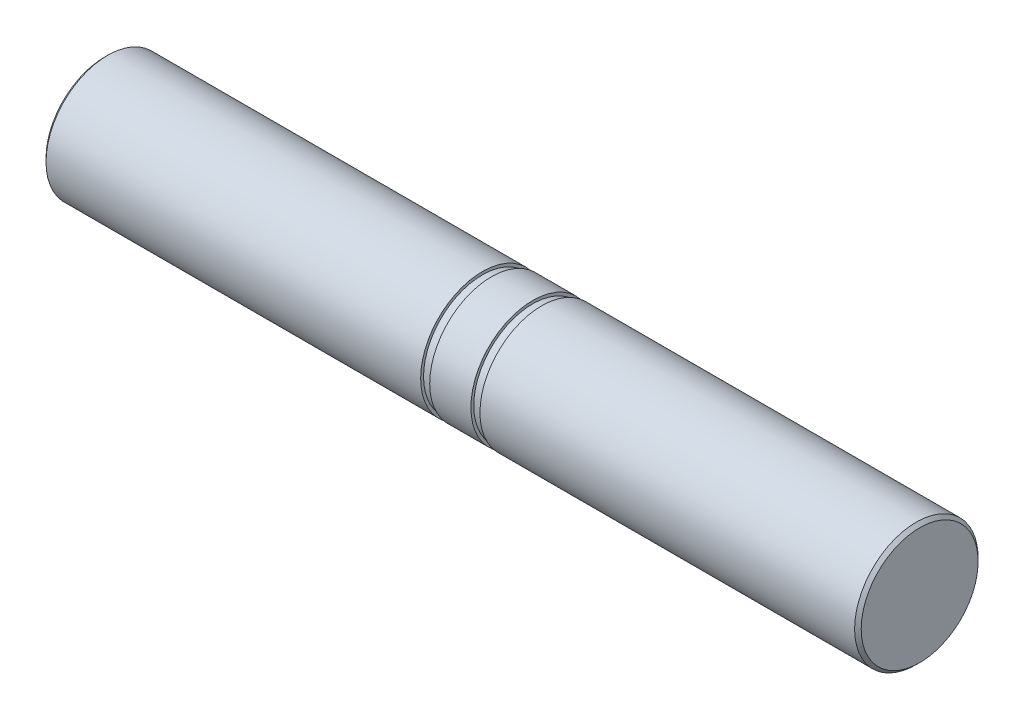
ISO-10303-21;
HEADER;
FILE_DESCRIPTION(('STEP AP214'),'2;1');
FILE_NAME('part.step','',(''),(''),'','','');
FILE_SCHEMA(('AUTOMOTIVE_DESIGN { 1 0 10303 214 1 1 1 1 }'));
ENDSEC;
DATA;
#1=APPLICATION_CONTEXT('core data for automotive mechanical design processes');
#2=APPLICATION_PROTOCOL_DEFINITION('international standard','automotive_design',2000,#1);
#3=PRODUCT_CONTEXT('',#1,'mechanical');
#4=PRODUCT('Part','Part','',(#3));
#5=PRODUCT_RELATED_PRODUCT_CATEGORY('part','',(#4));
#6=PRODUCT_DEFINITION_FORMATION('','',#4);
#7=PRODUCT_DEFINITION_CONTEXT('part definition',#1,'design');
#8=PRODUCT_DEFINITION('design','',#6,#7);
#9=PRODUCT_DEFINITION_SHAPE('','',#8);
#10=(LENGTH_UNIT() NAMED_UNIT(*) SI_UNIT(.MILLI.,.METRE.));
#11=(NAMED_UNIT(*) PLANE_ANGLE_UNIT() SI_UNIT($,.RADIAN.));
#12=(NAMED_UNIT(*) SI_UNIT($,.STERADIAN.) SOLID_ANGLE_UNIT());
#13=UNCERTAINTY_MEASURE_WITH_UNIT(LENGTH_MEASURE(1.E-05),#10,'distance_accuracy_value','');
#14=(GEOMETRIC_REPRESENTATION_CONTEXT(3) GLOBAL_UNCERTAINTY_ASSIGNED_CONTEXT((#13)) GLOBAL_UNIT_ASSIGNED_CONTEXT((#10,
#11,#12)) REPRESENTATION_CONTEXT('',''));
#15=CARTESIAN_POINT('',(0.,0.,0.));
#16=DIRECTION('',(0.,0.,1.));
#17=DIRECTION('',(1.,0.,0.));
#18=AXIS2_PLACEMENT_3D('',#15,#16,#17);
#19=CARTESIAN_POINT('',(49.5,0.,0.));
#20=DIRECTION('',(-1.,0.,0.));
#21=DIRECTION('',(0.,0.,-1.));
#22=AXIS2_PLACEMENT_3D('',#19,#20,#21);
#23=CYLINDRICAL_SURFACE('',#22,7.5);
#24=CARTESIAN_POINT('',(-3.6,0.,0.));
#25=DIRECTION('',(-1.,0.,0.));
#26=DIRECTION('',(0.,0.,1.));
#27=AXIS2_PLACEMENT_3D('',#24,#25,#26);
#28=CIRCLE('',#27,7.5);
#29=CARTESIAN_POINT('',(-3.6,0.,7.5));
#30=VERTEX_POINT('',#29);
#31=EDGE_CURVE('E56',#30,#30,#28,.T.);
#32=ORIENTED_EDGE('',*,*,#31,.T.);
#33=EDGE_LOOP('',(#32));
#34=FACE_BOUND('',#33,.T.);
#35=CARTESIAN_POINT('',(-49.1,0.,0.));
#36=DIRECTION('',(-1.,0.,0.));
#37=DIRECTION('',(0.,0.,1.));
#38=AXIS2_PLACEMENT_3D('',#35,#36,#37);
#39=CIRCLE('',#38,7.5);
#40=CARTESIAN_POINT('',(-49.1,0.,7.5));
#41=VERTEX_POINT('',#40);
#42=EDGE_CURVE('E43',#41,#41,#39,.T.);
#43=ORIENTED_EDGE('',*,*,#42,.F.);
#44=EDGE_LOOP('',(#43));
#45=FACE_BOUND('',#44,.T.);
#46=ADVANCED_FACE('F32',(#34,#45),#23,.T.);
#47=CARTESIAN_POINT('',(-49.5,0.,0.));
#48=DIRECTION('',(1.,0.,0.));
#49=DIRECTION('',(0.,0.,1.));
#50=AXIS2_PLACEMENT_3D('',#47,#48,#49);
#51=PLANE('',#50);
#52=CARTESIAN_POINT('',(-49.5,0.,0.));
#53=DIRECTION('',(-1.,0.,0.));
#54=DIRECTION('',(0.,0.,1.));
#55=AXIS2_PLACEMENT_3D('',#52,#53,#54);
#56=CIRCLE('',#55,7.09999999999999);
#57=CARTESIAN_POINT('',(-49.5,0.,7.09999999999999));
#58=VERTEX_POINT('',#57);
#59=EDGE_CURVE('E10',#58,#58,#56,.F.);
#60=ORIENTED_EDGE('',*,*,#59,.F.);
#61=EDGE_LOOP('',(#60));
#62=FACE_BOUND('',#61,.T.);
#63=ADVANCED_FACE('F91',(#62),#51,.F.);
#64=CARTESIAN_POINT('',(-49.1,0.,0.));
#65=DIRECTION('',(1.,0.,0.));
#66=DIRECTION('',(0.,0.,1.));
#67=AXIS2_PLACEMENT_3D('',#64,#65,#66);
#68=CONICAL_SURFACE('',#67,7.5,0.785398163397441);
#69=ORIENTED_EDGE('',*,*,#59,.T.);
#70=EDGE_LOOP('',(#69));
#71=FACE_BOUND('',#70,.T.);
#72=ORIENTED_EDGE('',*,*,#42,.T.);
#73=EDGE_LOOP('',(#72));
#74=FACE_BOUND('',#73,.T.);
#75=ADVANCED_FACE('F34',(#71,#74),#68,.T.);
#76=CARTESIAN_POINT('',(-3.6,7.5,0.));
#77=DIRECTION('',(-1.,0.,0.));
#78=DIRECTION('',(0.,0.,-1.));
#79=AXIS2_PLACEMENT_3D('',#76,#77,#78);
#80=PLANE('',#79);
#81=CARTESIAN_POINT('',(-3.6,0.,0.));
#82=DIRECTION('',(-1.,0.,0.));
#83=DIRECTION('',(0.,0.,1.));
#84=AXIS2_PLACEMENT_3D('',#81,#82,#83);
#85=CIRCLE('',#84,7.15);
#86=CARTESIAN_POINT('',(-3.6,0.,7.15));
#87=VERTEX_POINT('',#86);
#88=EDGE_CURVE('E52',#87,#87,#85,.T.);
#89=ORIENTED_EDGE('',*,*,#88,.T.);
#90=EDGE_LOOP('',(#89));
#91=FACE_BOUND('',#90,.T.);
#92=ORIENTED_EDGE('',*,*,#31,.F.);
#93=EDGE_LOOP('',(#92));
#94=FACE_BOUND('',#93,.T.);
#95=ADVANCED_FACE('F79',(#91,#94),#80,.F.);
#96=CARTESIAN_POINT('',(0.,0.,0.));
#97=DIRECTION('',(1.,0.,0.));
#98=DIRECTION('',(0.,0.,1.));
#99=AXIS2_PLACEMENT_3D('',#96,#97,#98);
#100=CYLINDRICAL_SURFACE('',#99,7.15);
#101=CARTESIAN_POINT('',(-2.5,0.,0.));
#102=DIRECTION('',(-1.,0.,0.));
#103=DIRECTION('',(0.,0.,1.));
#104=AXIS2_PLACEMENT_3D('',#101,#102,#103);
#105=CIRCLE('',#104,7.15);
#106=CARTESIAN_POINT('',(-2.5,0.,7.15));
#107=VERTEX_POINT('',#106);
#108=EDGE_CURVE('E68',#107,#107,#105,.T.);
#109=ORIENTED_EDGE('',*,*,#108,.T.);
#110=EDGE_LOOP('',(#109));
#111=FACE_BOUND('',#110,.T.);
#112=ORIENTED_EDGE('',*,*,#88,.F.);
#113=EDGE_LOOP('',(#112));
#114=FACE_BOUND('',#113,.T.);
#115=ADVANCED_FACE('F81',(#111,#114),#100,.T.);
#116=CARTESIAN_POINT('',(-2.5,7.5,0.));
#117=DIRECTION('',(1.,0.,0.));
#118=DIRECTION('',(0.,0.,1.));
#119=AXIS2_PLACEMENT_3D('',#116,#117,#118);
#120=PLANE('',#119);
#121=CARTESIAN_POINT('',(-2.5,0.,0.));
#122=DIRECTION('',(-1.,0.,0.));
#123=DIRECTION('',(0.,0.,1.));
#124=AXIS2_PLACEMENT_3D('',#121,#122,#123);
#125=CIRCLE('',#124,7.5);
#126=CARTESIAN_POINT('',(-2.5,0.,7.5));
#127=VERTEX_POINT('',#126);
#128=EDGE_CURVE('E71',#127,#127,#125,.T.);
#129=ORIENTED_EDGE('',*,*,#128,.T.);
#130=EDGE_LOOP('',(#129));
#131=FACE_BOUND('',#130,.T.);
#132=ORIENTED_EDGE('',*,*,#108,.F.);
#133=EDGE_LOOP('',(#132));
#134=FACE_BOUND('',#133,.T.);
#135=ADVANCED_FACE('F88',(#131,#134),#120,.F.);
#136=ORIENTED_EDGE('',*,*,#128,.F.);
#137=EDGE_LOOP('',(#136));
#138=FACE_BOUND('',#137,.T.);
#139=CARTESIAN_POINT('',(2.5,0.,0.));
#140=DIRECTION('',(-1.,0.,0.));
#141=DIRECTION('',(0.,0.,1.));
#142=AXIS2_PLACEMENT_3D('',#139,#140,#141);
#143=CIRCLE('',#142,7.5);
#144=CARTESIAN_POINT('',(2.5,0.,7.5));
#145=VERTEX_POINT('',#144);
#146=EDGE_CURVE('E63',#145,#145,#143,.T.);
#147=ORIENTED_EDGE('',*,*,#146,.T.);
#148=EDGE_LOOP('',(#147));
#149=FACE_BOUND('',#148,.T.);
#150=ADVANCED_FACE('F95',(#138,#149),#23,.T.);
#151=CARTESIAN_POINT('',(2.5,7.5,0.));
#152=DIRECTION('',(-1.,0.,0.));
#153=DIRECTION('',(0.,0.,-1.));
#154=AXIS2_PLACEMENT_3D('',#151,#152,#153);
#155=PLANE('',#154);
#156=CARTESIAN_POINT('',(2.5,0.,0.));
#157=DIRECTION('',(-1.,0.,0.));
#158=DIRECTION('',(0.,0.,1.));
#159=AXIS2_PLACEMENT_3D('',#156,#157,#158);
#160=CIRCLE('',#159,7.15);
#161=CARTESIAN_POINT('',(2.5,0.,7.15));
#162=VERTEX_POINT('',#161);
#163=EDGE_CURVE('E53',#162,#162,#160,.T.);
#164=ORIENTED_EDGE('',*,*,#163,.T.);
#165=EDGE_LOOP('',(#164));
#166=FACE_BOUND('',#165,.T.);
#167=ORIENTED_EDGE('',*,*,#146,.F.);
#168=EDGE_LOOP('',(#167));
#169=FACE_BOUND('',#168,.T.);
#170=ADVANCED_FACE('F103',(#166,#169),#155,.F.);
#171=CARTESIAN_POINT('',(0.,0.,0.));
#172=DIRECTION('',(1.,0.,0.));
#173=DIRECTION('',(0.,0.,1.));
#174=AXIS2_PLACEMENT_3D('',#171,#172,#173);
#175=CYLINDRICAL_SURFACE('',#174,7.15);
#176=CARTESIAN_POINT('',(3.6,0.,0.));
#177=DIRECTION('',(-1.,0.,0.));
#178=DIRECTION('',(0.,0.,1.));
#179=AXIS2_PLACEMENT_3D('',#176,#177,#178);
#180=CIRCLE('',#179,7.15);
#181=CARTESIAN_POINT('',(3.6,0.,7.15));
#182=VERTEX_POINT('',#181);
#183=EDGE_CURVE('E57',#182,#182,#180,.T.);
#184=ORIENTED_EDGE('',*,*,#183,.T.);
#185=EDGE_LOOP('',(#184));
#186=FACE_BOUND('',#185,.T.);
#187=ORIENTED_EDGE('',*,*,#163,.F.);
#188=EDGE_LOOP('',(#187));
#189=FACE_BOUND('',#188,.T.);
#190=ADVANCED_FACE('F118',(#186,#189),#175,.T.);
#191=CARTESIAN_POINT('',(3.6,7.5,0.));
#192=DIRECTION('',(1.,0.,0.));
#193=DIRECTION('',(0.,0.,1.));
#194=AXIS2_PLACEMENT_3D('',#191,#192,#193);
#195=PLANE('',#194);
#196=CARTESIAN_POINT('',(3.6,0.,0.));
#197=DIRECTION('',(-1.,0.,0.));
#198=DIRECTION('',(0.,0.,1.));
#199=AXIS2_PLACEMENT_3D('',#196,#197,#198);
#200=CIRCLE('',#199,7.5);
#201=CARTESIAN_POINT('',(3.6,0.,7.5));
#202=VERTEX_POINT('',#201);
#203=EDGE_CURVE('E60',#202,#202,#200,.T.);
#204=ORIENTED_EDGE('',*,*,#203,.T.);
#205=EDGE_LOOP('',(#204));
#206=FACE_BOUND('',#205,.T.);
#207=ORIENTED_EDGE('',*,*,#183,.F.);
#208=EDGE_LOOP('',(#207));
#209=FACE_BOUND('',#208,.T.);
#210=ADVANCED_FACE('F115',(#206,#209),#195,.F.);
#211=CARTESIAN_POINT('',(49.5,0.,0.));
#212=DIRECTION('',(1.,0.,0.));
#213=DIRECTION('',(0.,0.,1.));
#214=AXIS2_PLACEMENT_3D('',#211,#212,#213);
#215=PLANE('',#214);
#216=CARTESIAN_POINT('',(49.5,0.,0.));
#217=DIRECTION('',(-1.,0.,0.));
#218=DIRECTION('',(0.,0.,1.));
#219=AXIS2_PLACEMENT_3D('',#216,#217,#218);
#220=CIRCLE('',#219,7.10000000000001);
#221=CARTESIAN_POINT('',(49.5,0.,7.10000000000001));
#222=VERTEX_POINT('',#221);
#223=EDGE_CURVE('E47',#222,#222,#220,.T.);
#224=ORIENTED_EDGE('',*,*,#223,.F.);
#225=EDGE_LOOP('',(#224));
#226=FACE_BOUND('',#225,.T.);
#227=ADVANCED_FACE('F111',(#226),#215,.T.);
#228=CARTESIAN_POINT('',(49.5,0.,0.));
#229=DIRECTION('',(-1.,0.,0.));
#230=DIRECTION('',(0.,0.,-1.));
#231=AXIS2_PLACEMENT_3D('',#228,#229,#230);
#232=CONICAL_SURFACE('',#231,7.10000000000001,0.785398163397448);
#233=CARTESIAN_POINT('',(49.1,0.,0.));
#234=DIRECTION('',(-1.,0.,0.));
#235=DIRECTION('',(0.,0.,1.));
#236=AXIS2_PLACEMENT_3D('',#233,#234,#235);
#237=CIRCLE('',#236,7.5);
#238=CARTESIAN_POINT('',(49.1,0.,7.5));
#239=VERTEX_POINT('',#238);
#240=EDGE_CURVE('E39',#239,#239,#237,.F.);
#241=ORIENTED_EDGE('',*,*,#240,.T.);
#242=EDGE_LOOP('',(#241));
#243=FACE_BOUND('',#242,.T.);
#244=ORIENTED_EDGE('',*,*,#223,.T.);
#245=EDGE_LOOP('',(#244));
#246=FACE_BOUND('',#245,.T.);
#247=ADVANCED_FACE('F106',(#243,#246),#232,.T.);
#248=ORIENTED_EDGE('',*,*,#203,.F.);
#249=EDGE_LOOP('',(#248));
#250=FACE_BOUND('',#249,.T.);
#251=ORIENTED_EDGE('',*,*,#240,.F.);
#252=EDGE_LOOP('',(#251));
#253=FACE_BOUND('',#252,.T.);
#254=ADVANCED_FACE('F96',(#250,#253),#23,.T.);
#255=CLOSED_SHELL('',(#46,#63,#75,#95,#115,#135,#150,#170,#190,#210,#227,#247,#254));
#256=MANIFOLD_SOLID_BREP('B2',#255);
#257=ADVANCED_BREP_SHAPE_REPRESENTATION('',(#18,#256),#14);
#258=SHAPE_DEFINITION_REPRESENTATION(#9,#257);
ENDSEC;
END-ISO-10303-21;
